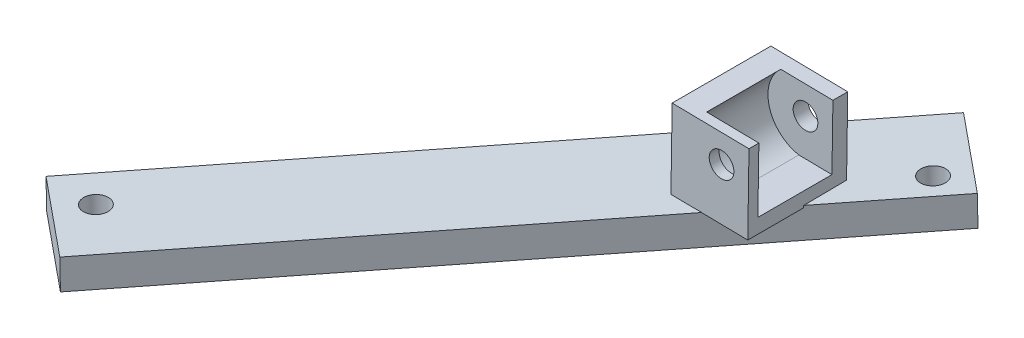
ISO-10303-21;
HEADER;
FILE_DESCRIPTION(('STEP AP214'),'2;1');
FILE_NAME('part.step','',(''),(''),'','','');
FILE_SCHEMA(('AUTOMOTIVE_DESIGN { 1 0 10303 214 1 1 1 1 }'));
ENDSEC;
DATA;
#1=APPLICATION_CONTEXT('core data for automotive mechanical design processes');
#2=APPLICATION_PROTOCOL_DEFINITION('international standard','automotive_design',2000,#1);
#3=PRODUCT_CONTEXT('',#1,'mechanical');
#4=PRODUCT('Part','Part','',(#3));
#5=PRODUCT_RELATED_PRODUCT_CATEGORY('part','',(#4));
#6=PRODUCT_DEFINITION_FORMATION('','',#4);
#7=PRODUCT_DEFINITION_CONTEXT('part definition',#1,'design');
#8=PRODUCT_DEFINITION('design','',#6,#7);
#9=PRODUCT_DEFINITION_SHAPE('','',#8);
#10=(LENGTH_UNIT() NAMED_UNIT(*) SI_UNIT(.MILLI.,.METRE.));
#11=(NAMED_UNIT(*) PLANE_ANGLE_UNIT() SI_UNIT($,.RADIAN.));
#12=(NAMED_UNIT(*) SI_UNIT($,.STERADIAN.) SOLID_ANGLE_UNIT());
#13=UNCERTAINTY_MEASURE_WITH_UNIT(LENGTH_MEASURE(1.E-05),#10,'distance_accuracy_value','');
#14=(GEOMETRIC_REPRESENTATION_CONTEXT(3) GLOBAL_UNCERTAINTY_ASSIGNED_CONTEXT((#13)) GLOBAL_UNIT_ASSIGNED_CONTEXT((#10,
#11,#12)) REPRESENTATION_CONTEXT('',''));
#15=CARTESIAN_POINT('',(0.,0.,0.));
#16=DIRECTION('',(0.,0.,1.));
#17=DIRECTION('',(1.,0.,0.));
#18=AXIS2_PLACEMENT_3D('',#15,#16,#17);
#19=CARTESIAN_POINT('',(1.23244160219368,80.7225949257512,21.59));
#20=DIRECTION('',(0.0152658371215677,0.999883470318906,0.));
#21=DIRECTION('',(-0.999883470318906,0.0152658371215677,0.));
#22=AXIS2_PLACEMENT_3D('',#19,#20,#21);
#23=PLANE('',#22);
#24=DIRECTION('',(0.,0.,-1.));
#25=VECTOR('',#24,1.);
#26=CARTESIAN_POINT('',(-621.150306901994,90.224895891791,21.59));
#27=LINE('',#26,#25);
#28=CARTESIAN_POINT('',(-621.150306901994,90.224895891791,21.59));
#29=VERTEX_POINT('',#28);
#30=CARTESIAN_POINT('',(-621.150306901994,90.224895891791,7.21198114716159));
#31=VERTEX_POINT('',#30);
#32=EDGE_CURVE('E261',#29,#31,#27,.T.);
#33=ORIENTED_EDGE('',*,*,#32,.F.);
#34=DIRECTION('',(-0.999883470318906,0.0152658371215677,0.));
#35=VECTOR('',#34,1.);
#36=CARTESIAN_POINT('',(1.23244160219368,80.7225949257512,21.59));
#37=LINE('',#36,#35);
#38=CARTESIAN_POINT('',(-632.948418817548,90.4050249370161,21.59));
#39=VERTEX_POINT('',#38);
#40=EDGE_CURVE('E246',#29,#39,#37,.T.);
#41=ORIENTED_EDGE('',*,*,#40,.T.);
#42=DIRECTION('',(-0.634311385000374,0.00968442281047344,0.773016997752142));
#43=VECTOR('',#42,1.);
#44=CARTESIAN_POINT('',(-377.72567926426,86.5083820907271,-289.442594641894));
#45=LINE('',#44,#43);
#46=EDGE_CURVE('E196',#31,#39,#45,.T.);
#47=ORIENTED_EDGE('',*,*,#46,.F.);
#48=EDGE_LOOP('',(#33,#41,#47));
#49=FACE_BOUND('',#48,.T.);
#50=ADVANCED_FACE('F43',(#49),#23,.F.);
#51=CARTESIAN_POINT('',(-627.893070479448,103.664395922966,21.59));
#52=DIRECTION('',(0.,0.,-1.));
#53=DIRECTION('',(1.,0.,0.));
#54=AXIS2_PLACEMENT_3D('',#51,#52,#53);
#55=CYLINDRICAL_SURFACE('',#54,9.65200000000006);
#56=CARTESIAN_POINT('',(-627.893070479448,103.664395922966,19.0499999999996));
#57=DIRECTION('',(0.,0.,-1.));
#58=DIRECTION('',(-1.,0.,0.));
#59=AXIS2_PLACEMENT_3D('',#56,#57,#58);
#60=CIRCLE('',#59,9.65200000000008);
#61=CARTESIAN_POINT('',(-629.598897848948,94.164329766067,19.0499999999997));
#62=VERTEX_POINT('',#61);
#63=CARTESIAN_POINT('',(-634.25254540357,110.925124721748,19.0499999999998));
#64=VERTEX_POINT('',#63);
#65=EDGE_CURVE('E225',#62,#64,#60,.T.);
#66=ORIENTED_EDGE('',*,*,#65,.F.);
#67=DIRECTION('',(0.,0.,-1.));
#68=VECTOR('',#67,1.);
#69=CARTESIAN_POINT('',(-629.598897848948,94.164329766067,21.59));
#70=LINE('',#69,#68);
#71=CARTESIAN_POINT('',(-629.598897848948,94.164329766067,0.));
#72=VERTEX_POINT('',#71);
#73=EDGE_CURVE('E255',#62,#72,#70,.T.);
#74=ORIENTED_EDGE('',*,*,#73,.T.);
#75=CARTESIAN_POINT('',(-627.893070479448,103.664395922966,0.));
#76=DIRECTION('',(0.,0.,1.));
#77=DIRECTION('',(1.,0.,0.));
#78=AXIS2_PLACEMENT_3D('',#75,#76,#77);
#79=CIRCLE('',#78,9.65200000000006);
#80=CARTESIAN_POINT('',(-634.25254540357,110.925124721748,0.));
#81=VERTEX_POINT('',#80);
#82=EDGE_CURVE('E238',#81,#72,#79,.T.);
#83=ORIENTED_EDGE('',*,*,#82,.F.);
#84=DIRECTION('',(0.,0.,-1.));
#85=VECTOR('',#84,1.);
#86=CARTESIAN_POINT('',(-634.25254540357,110.925124721748,21.59));
#87=LINE('',#86,#85);
#88=EDGE_CURVE('E251',#64,#81,#87,.T.);
#89=ORIENTED_EDGE('',*,*,#88,.F.);
#90=EDGE_LOOP('',(#66,#74,#83,#89));
#91=FACE_BOUND('',#90,.T.);
#92=ADVANCED_FACE('F45',(#91),#55,.F.);
#93=CARTESIAN_POINT('',(1.29060444162685,84.5321509476663,21.59));
#94=DIRECTION('',(0.0152658371215677,0.999883470318906,0.));
#95=DIRECTION('',(-0.999883470318906,0.0152658371215677,0.));
#96=AXIS2_PLACEMENT_3D('',#93,#94,#95);
#97=PLANE('',#96);
#98=DIRECTION('',(0.,0.,-1.));
#99=VECTOR('',#98,1.);
#100=CARTESIAN_POINT('',(-621.092144062561,94.0344519137061,21.59));
#101=LINE('',#100,#99);
#102=CARTESIAN_POINT('',(-621.092144062561,94.0344519137061,19.0499999999996));
#103=VERTEX_POINT('',#102);
#104=CARTESIAN_POINT('',(-621.092144062561,94.0344519137061,0.));
#105=VERTEX_POINT('',#104);
#106=EDGE_CURVE('E258',#103,#105,#101,.T.);
#107=ORIENTED_EDGE('',*,*,#106,.T.);
#108=DIRECTION('',(-0.999883470318906,0.0152658371215677,0.));
#109=VECTOR('',#108,1.);
#110=CARTESIAN_POINT('',(1.29060444162685,84.5321509476663,0.));
#111=LINE('',#110,#109);
#112=EDGE_CURVE('E242',#105,#72,#111,.T.);
#113=ORIENTED_EDGE('',*,*,#112,.T.);
#114=ORIENTED_EDGE('',*,*,#73,.F.);
#115=DIRECTION('',(-0.999883470318906,0.0152658371215695,0.));
#116=VECTOR('',#115,1.);
#117=CARTESIAN_POINT('',(1.29060444162699,84.5321509476652,19.05));
#118=LINE('',#117,#116);
#119=EDGE_CURVE('E65',#103,#62,#118,.T.);
#120=ORIENTED_EDGE('',*,*,#119,.F.);
#121=EDGE_LOOP('',(#107,#113,#114,#120));
#122=FACE_BOUND('',#121,.T.);
#123=ADVANCED_FACE('F307',(#122),#97,.T.);
#124=CARTESIAN_POINT('',(-622.382748504188,9.50230096603983,21.59));
#125=DIRECTION('',(-0.999883470318906,0.0152658371215677,0.));
#126=DIRECTION('',(-0.0152658371215678,-0.999883470318906,0.));
#127=AXIS2_PLACEMENT_3D('',#124,#125,#126);
#128=PLANE('',#127);
#129=DIRECTION('',(-0.000170947301251259,-0.0111967250440051,0.999937300097016));
#130=VECTOR('',#129,1.);
#131=CARTESIAN_POINT('',(-621.144892584329,90.5795234627043,22.4980679115256));
#132=LINE('',#131,#130);
#133=CARTESIAN_POINT('',(-621.140395009121,90.8741061358537,-3.81));
#134=VERTEX_POINT('',#133);
#135=CARTESIAN_POINT('',(-621.142277501478,90.750806445438,7.20143048993949));
#136=VERTEX_POINT('',#135);
#137=EDGE_CURVE('E192',#134,#136,#132,.T.);
#138=ORIENTED_EDGE('',*,*,#137,.F.);
#139=DIRECTION('',(-0.0152658371215623,-0.999883470318906,0.));
#140=VECTOR('',#139,1.);
#141=CARTESIAN_POINT('',(-620.837390825843,110.720307289694,-3.81));
#142=LINE('',#141,#140);
#143=CARTESIAN_POINT('',(-620.837390825843,110.720307289694,-3.81));
#144=VERTEX_POINT('',#143);
#145=EDGE_CURVE('E214',#144,#134,#142,.T.);
#146=ORIENTED_EDGE('',*,*,#145,.F.);
#147=DIRECTION('',(0.,0.,1.));
#148=VECTOR('',#147,1.);
#149=CARTESIAN_POINT('',(-620.837390825843,110.720307289694,-3.81));
#150=LINE('',#149,#148);
#151=CARTESIAN_POINT('',(-620.837390825843,110.720307289694,0.));
#152=VERTEX_POINT('',#151);
#153=EDGE_CURVE('E216',#144,#152,#150,.T.);
#154=ORIENTED_EDGE('',*,*,#153,.T.);
#155=DIRECTION('',(-0.0152658371215623,-0.999883470318906,0.));
#156=VECTOR('',#155,1.);
#157=CARTESIAN_POINT('',(-620.837390825843,110.720307289694,0.));
#158=LINE('',#157,#156);
#159=EDGE_CURVE('E212',#152,#105,#158,.T.);
#160=ORIENTED_EDGE('',*,*,#159,.T.);
#161=ORIENTED_EDGE('',*,*,#106,.F.);
#162=DIRECTION('',(0.0152658371215684,0.999883470318906,0.));
#163=VECTOR('',#162,1.);
#164=CARTESIAN_POINT('',(-622.382748504188,9.50230096604021,19.0499999999996));
#165=LINE('',#164,#163);
#166=CARTESIAN_POINT('',(-620.837390825843,110.720307289694,19.0499999999998));
#167=VERTEX_POINT('',#166);
#168=EDGE_CURVE('E221',#103,#167,#165,.T.);
#169=ORIENTED_EDGE('',*,*,#168,.T.);
#170=DIRECTION('',(0.,0.,-1.));
#171=VECTOR('',#170,1.);
#172=CARTESIAN_POINT('',(-620.837390825843,110.720307289694,45.3479752360297));
#173=LINE('',#172,#171);
#174=CARTESIAN_POINT('',(-620.837390825843,110.720307289694,21.59));
#175=VERTEX_POINT('',#174);
#176=EDGE_CURVE('E232',#175,#167,#173,.T.);
#177=ORIENTED_EDGE('',*,*,#176,.F.);
#178=DIRECTION('',(-0.0152658371215678,-0.999883470318906,0.));
#179=VECTOR('',#178,1.);
#180=CARTESIAN_POINT('',(-622.382748504188,9.50230096603983,21.59));
#181=LINE('',#180,#179);
#182=EDGE_CURVE('E249',#175,#29,#181,.T.);
#183=ORIENTED_EDGE('',*,*,#182,.T.);
#184=ORIENTED_EDGE('',*,*,#32,.T.);
#185=DIRECTION('',(-0.0152627667310032,-0.999682365541718,0.0200553229001458));
#186=VECTOR('',#185,1.);
#187=CARTESIAN_POINT('',(-622.38665390396,9.24650466437761,8.83654494860488));
#188=LINE('',#187,#186);
#189=EDGE_CURVE('E199',#136,#31,#188,.T.);
#190=ORIENTED_EDGE('',*,*,#189,.F.);
#191=EDGE_LOOP('',(#138,#146,#154,#160,#161,#169,#177,#183,#184,#190));
#192=FACE_BOUND('',#191,.T.);
#193=ADVANCED_FACE('F287',(#192),#128,.F.);
#194=CARTESIAN_POINT('',(-635.371075882775,90.4420131353982,21.59));
#195=VERTEX_POINT('',#194);
#196=CARTESIAN_POINT('',(-640.914721516246,90.5266513895672,21.59));
#197=VERTEX_POINT('',#196);
#198=EDGE_CURVE('E245',#195,#197,#37,.T.);
#199=ORIENTED_EDGE('',*,*,#198,.T.);
#200=DIRECTION('',(0.,0.,-1.));
#201=VECTOR('',#200,1.);
#202=CARTESIAN_POINT('',(-640.914721516246,90.5266513895672,21.59));
#203=LINE('',#202,#201);
#204=CARTESIAN_POINT('',(-640.914721516246,90.5266513895672,8.89000000001139));
#205=VERTEX_POINT('',#204);
#206=EDGE_CURVE('E264',#197,#205,#203,.T.);
#207=ORIENTED_EDGE('',*,*,#206,.T.);
#208=DIRECTION('',(-0.400047773889427,0.00610777589421889,-0.916473935079302));
#209=VECTOR('',#208,1.);
#210=CARTESIAN_POINT('',(-533.46643276404,88.8861721499623,255.044490632144));
#211=LINE('',#210,#209);
#212=EDGE_CURVE('E188',#195,#205,#211,.T.);
#213=ORIENTED_EDGE('',*,*,#212,.F.);
#214=EDGE_LOOP('',(#199,#207,#213));
#215=FACE_BOUND('',#214,.T.);
#216=ADVANCED_FACE('F314',(#215),#23,.F.);
#217=CARTESIAN_POINT('',(-642.147163118439,9.80405646381606,21.59));
#218=DIRECTION('',(0.999883470318906,-0.0152658371215678,0.));
#219=DIRECTION('',(0.0152658371215678,0.999883470318906,0.));
#220=AXIS2_PLACEMENT_3D('',#217,#218,#219);
#221=PLANE('',#220);
#222=ORIENTED_EDGE('',*,*,#206,.F.);
#223=DIRECTION('',(0.0152658371215678,0.999883470318906,0.));
#224=VECTOR('',#223,1.);
#225=CARTESIAN_POINT('',(-642.147163118439,9.80405646381606,21.59));
#226=LINE('',#225,#224);
#227=CARTESIAN_POINT('',(-640.601805440095,111.02206278747,21.59));
#228=VERTEX_POINT('',#227);
#229=EDGE_CURVE('E241',#197,#228,#226,.T.);
#230=ORIENTED_EDGE('',*,*,#229,.T.);
#231=DIRECTION('',(0.,0.,-1.));
#232=VECTOR('',#231,1.);
#233=CARTESIAN_POINT('',(-640.601805440095,111.02206278747,21.59));
#234=LINE('',#233,#232);
#235=CARTESIAN_POINT('',(-640.601805440095,111.02206278747,-3.81));
#236=VERTEX_POINT('',#235);
#237=EDGE_CURVE('E267',#228,#236,#234,.T.);
#238=ORIENTED_EDGE('',*,*,#237,.T.);
#239=DIRECTION('',(0.0152658371215677,0.999883470318906,0.));
#240=VECTOR('',#239,1.);
#241=CARTESIAN_POINT('',(-640.914721516246,90.5266513895672,-3.81));
#242=LINE('',#241,#240);
#243=CARTESIAN_POINT('',(-640.912550349388,90.6688587140116,-3.81));
#244=VERTEX_POINT('',#243);
#245=EDGE_CURVE('E208',#244,#236,#242,.T.);
#246=ORIENTED_EDGE('',*,*,#245,.F.);
#247=DIRECTION('',(0.000170947301251259,0.0111967250440051,-0.999937300097016));
#248=VECTOR('',#247,1.);
#249=CARTESIAN_POINT('',(-640.917046953941,90.3743396169369,22.4923901719979));
#250=LINE('',#249,#248);
#251=EDGE_CURVE('E186',#205,#244,#250,.T.);
#252=ORIENTED_EDGE('',*,*,#251,.F.);
#253=EDGE_LOOP('',(#222,#230,#238,#246,#252));
#254=FACE_BOUND('',#253,.T.);
#255=ADVANCED_FACE('F294',(#254),#221,.F.);
#256=CARTESIAN_POINT('',(1.54535767834408,101.218006323655,21.59));
#257=DIRECTION('',(-0.015265837121567,-0.999883470318906,0.));
#258=DIRECTION('',(0.999883470318906,-0.015265837121567,0.));
#259=AXIS2_PLACEMENT_3D('',#256,#257,#258);
#260=PLANE('',#259);
#261=ORIENTED_EDGE('',*,*,#237,.F.);
#262=DIRECTION('',(0.999883470318906,-0.015265837121567,0.));
#263=VECTOR('',#262,1.);
#264=CARTESIAN_POINT('',(1.54535767834408,101.218006323655,21.59));
#265=LINE('',#264,#263);
#266=EDGE_CURVE('E239',#228,#175,#265,.T.);
#267=ORIENTED_EDGE('',*,*,#266,.T.);
#268=ORIENTED_EDGE('',*,*,#176,.T.);
#269=DIRECTION('',(0.999883470318906,-0.0152658371215682,0.));
#270=VECTOR('',#269,1.);
#271=CARTESIAN_POINT('',(1.54535767834418,101.218006323654,19.0499999999998));
#272=LINE('',#271,#270);
#273=EDGE_CURVE('E227',#64,#167,#272,.T.);
#274=ORIENTED_EDGE('',*,*,#273,.F.);
#275=ORIENTED_EDGE('',*,*,#88,.T.);
#276=DIRECTION('',(0.999883470318906,-0.0152658371215671,0.));
#277=VECTOR('',#276,1.);
#278=CARTESIAN_POINT('',(-640.601805440095,111.02206278747,0.));
#279=LINE('',#278,#277);
#280=EDGE_CURVE('E205',#81,#152,#279,.T.);
#281=ORIENTED_EDGE('',*,*,#280,.T.);
#282=ORIENTED_EDGE('',*,*,#153,.F.);
#283=DIRECTION('',(0.999883470318906,-0.0152658371215671,0.));
#284=VECTOR('',#283,1.);
#285=CARTESIAN_POINT('',(-640.601805440095,111.02206278747,-3.81));
#286=LINE('',#285,#284);
#287=EDGE_CURVE('E211',#236,#144,#286,.T.);
#288=ORIENTED_EDGE('',*,*,#287,.F.);
#289=EDGE_LOOP('',(#261,#267,#268,#274,#275,#281,#282,#288));
#290=FACE_BOUND('',#289,.T.);
#291=ADVANCED_FACE('F275',(#290),#260,.F.);
#292=CARTESIAN_POINT('',(0.,0.,21.59));
#293=DIRECTION('',(0.,0.,-1.));
#294=DIRECTION('',(1.,0.,0.));
#295=AXIS2_PLACEMENT_3D('',#292,#293,#294);
#296=PLANE('',#295);
#297=ORIENTED_EDGE('',*,*,#40,.F.);
#298=ORIENTED_EDGE('',*,*,#182,.F.);
#299=ORIENTED_EDGE('',*,*,#266,.F.);
#300=ORIENTED_EDGE('',*,*,#229,.F.);
#301=ORIENTED_EDGE('',*,*,#198,.F.);
#302=DIRECTION('',(-0.999946125618088,-0.0103800703935441,0.));
#303=VECTOR('',#302,1.);
#304=CARTESIAN_POINT('',(-1.00720248977155,97.0271095643389,21.59));
#305=LINE('',#304,#303);
#306=CARTESIAN_POINT('',(-632.94849300974,90.467161070984,21.59));
#307=VERTEX_POINT('',#306);
#308=EDGE_CURVE('E194',#307,#195,#305,.T.);
#309=ORIENTED_EDGE('',*,*,#308,.F.);
#310=DIRECTION('',(-0.00119402567209791,0.999999287151093,0.));
#311=VECTOR('',#310,1.);
#312=CARTESIAN_POINT('',(-632.83957058098,-0.755627232241153,21.59));
#313=LINE('',#312,#311);
#314=EDGE_CURVE('E11',#39,#307,#313,.T.);
#315=ORIENTED_EDGE('',*,*,#314,.F.);
#316=EDGE_LOOP('',(#297,#298,#299,#300,#301,#309,#315));
#317=FACE_BOUND('',#316,.T.);
#318=CARTESIAN_POINT('',(-627.893070479448,103.664395922966,21.59));
#319=DIRECTION('',(0.,0.,1.));
#320=DIRECTION('',(1.,0.,0.));
#321=AXIS2_PLACEMENT_3D('',#318,#319,#320);
#322=CIRCLE('',#321,3.17500000000009);
#323=CARTESIAN_POINT('',(-624.718070479448,103.664395922966,21.59));
#324=VERTEX_POINT('',#323);
#325=EDGE_CURVE('E235',#324,#324,#322,.F.);
#326=ORIENTED_EDGE('',*,*,#325,.T.);
#327=EDGE_LOOP('',(#326));
#328=FACE_BOUND('',#327,.T.);
#329=ADVANCED_FACE('F299',(#317,#328),#296,.F.);
#330=CARTESIAN_POINT('',(1.11022302462516E-13,0.,19.0499999999998));
#331=DIRECTION('',(0.,0.,1.));
#332=DIRECTION('',(-1.,0.,0.));
#333=AXIS2_PLACEMENT_3D('',#330,#331,#332);
#334=PLANE('',#333);
#335=ORIENTED_EDGE('',*,*,#168,.F.);
#336=ORIENTED_EDGE('',*,*,#119,.T.);
#337=ORIENTED_EDGE('',*,*,#65,.T.);
#338=ORIENTED_EDGE('',*,*,#273,.T.);
#339=EDGE_LOOP('',(#335,#336,#337,#338));
#340=FACE_BOUND('',#339,.T.);
#341=CARTESIAN_POINT('',(-627.893070479448,103.664395922966,19.0499999999996));
#342=DIRECTION('',(0.,0.,-1.));
#343=DIRECTION('',(-1.,0.,0.));
#344=AXIS2_PLACEMENT_3D('',#341,#342,#343);
#345=CIRCLE('',#344,3.17500000000009);
#346=CARTESIAN_POINT('',(-631.068070479448,103.664395922966,19.0499999999996));
#347=VERTEX_POINT('',#346);
#348=EDGE_CURVE('E229',#347,#347,#345,.F.);
#349=ORIENTED_EDGE('',*,*,#348,.T.);
#350=EDGE_LOOP('',(#349));
#351=FACE_BOUND('',#350,.T.);
#352=ADVANCED_FACE('F304',(#340,#351),#334,.F.);
#353=CARTESIAN_POINT('',(-627.893070479448,103.664395922966,45.3479752360294));
#354=DIRECTION('',(0.,0.,-1.));
#355=DIRECTION('',(1.,0.,0.));
#356=AXIS2_PLACEMENT_3D('',#353,#354,#355);
#357=CYLINDRICAL_SURFACE('',#356,3.17500000000009);
#358=ORIENTED_EDGE('',*,*,#325,.F.);
#359=EDGE_LOOP('',(#358));
#360=FACE_BOUND('',#359,.T.);
#361=ORIENTED_EDGE('',*,*,#348,.F.);
#362=EDGE_LOOP('',(#361));
#363=FACE_BOUND('',#362,.T.);
#364=ADVANCED_FACE('F388',(#360,#363),#357,.F.);
#365=CARTESIAN_POINT('',(0.,0.,0.));
#366=DIRECTION('',(0.,0.,1.));
#367=DIRECTION('',(-1.,0.,0.));
#368=AXIS2_PLACEMENT_3D('',#365,#366,#367);
#369=PLANE('',#368);
#370=CARTESIAN_POINT('',(-627.893070479448,103.664395922966,0.));
#371=DIRECTION('',(0.,0.,1.));
#372=DIRECTION('',(1.,0.,0.));
#373=AXIS2_PLACEMENT_3D('',#370,#371,#372);
#374=CIRCLE('',#373,3.17500000000008);
#375=CARTESIAN_POINT('',(-631.068070479448,103.664395922966,0.));
#376=VERTEX_POINT('',#375);
#377=EDGE_CURVE('E201',#376,#376,#374,.T.);
#378=ORIENTED_EDGE('',*,*,#377,.F.);
#379=EDGE_LOOP('',(#378));
#380=FACE_BOUND('',#379,.T.);
#381=ORIENTED_EDGE('',*,*,#82,.T.);
#382=ORIENTED_EDGE('',*,*,#112,.F.);
#383=ORIENTED_EDGE('',*,*,#159,.F.);
#384=ORIENTED_EDGE('',*,*,#280,.F.);
#385=EDGE_LOOP('',(#381,#382,#383,#384));
#386=FACE_BOUND('',#385,.T.);
#387=ADVANCED_FACE('F282',(#380,#386),#369,.T.);
#388=CARTESIAN_POINT('',(0.,0.,-3.81));
#389=DIRECTION('',(0.,0.,1.));
#390=DIRECTION('',(-1.,0.,0.));
#391=AXIS2_PLACEMENT_3D('',#388,#389,#390);
#392=PLANE('',#391);
#393=ORIENTED_EDGE('',*,*,#245,.T.);
#394=ORIENTED_EDGE('',*,*,#287,.T.);
#395=ORIENTED_EDGE('',*,*,#145,.T.);
#396=DIRECTION('',(0.999946125618088,0.0103800703935441,0.));
#397=VECTOR('',#396,1.);
#398=CARTESIAN_POINT('',(-1.01015410692916,97.3114484974248,-3.81));
#399=LINE('',#398,#397);
#400=EDGE_CURVE('E51',#244,#134,#399,.T.);
#401=ORIENTED_EDGE('',*,*,#400,.F.);
#402=EDGE_LOOP('',(#393,#394,#395,#401));
#403=FACE_BOUND('',#402,.T.);
#404=CARTESIAN_POINT('',(-627.893070479448,103.664395922966,-3.81));
#405=DIRECTION('',(0.,0.,1.));
#406=DIRECTION('',(1.,0.,0.));
#407=AXIS2_PLACEMENT_3D('',#404,#405,#406);
#408=CIRCLE('',#407,3.17500000000008);
#409=CARTESIAN_POINT('',(-631.068070479448,103.664395922966,-3.81));
#410=VERTEX_POINT('',#409);
#411=EDGE_CURVE('E202',#410,#410,#408,.T.);
#412=ORIENTED_EDGE('',*,*,#411,.T.);
#413=EDGE_LOOP('',(#412));
#414=FACE_BOUND('',#413,.T.);
#415=ADVANCED_FACE('F290',(#403,#414),#392,.F.);
#416=CARTESIAN_POINT('',(-627.893070479448,103.664395922966,-3.81));
#417=DIRECTION('',(0.,0.,1.));
#418=DIRECTION('',(-1.,0.,0.));
#419=AXIS2_PLACEMENT_3D('',#416,#417,#418);
#420=CYLINDRICAL_SURFACE('',#419,3.17500000000008);
#421=CARTESIAN_POINT('',(-631.068070479448,103.664395922966,-3.81));
#422=CARTESIAN_POINT('',(-631.068070479448,103.664395922966,-3.7703125));
#423=CARTESIAN_POINT('',(-631.068070479448,103.664395922966,-3.730625));
#424=CARTESIAN_POINT('',(-631.068070479448,103.664395922966,-3.65125));
#425=CARTESIAN_POINT('',(-631.068070479448,103.664395922966,-3.6115625));
#426=CARTESIAN_POINT('',(-631.068070479448,103.664395922966,-3.5321875));
#427=CARTESIAN_POINT('',(-631.068070479448,103.664395922966,-3.4925));
#428=CARTESIAN_POINT('',(-631.068070479448,103.664395922966,-3.413125));
#429=CARTESIAN_POINT('',(-631.068070479448,103.664395922966,-3.3734375));
#430=CARTESIAN_POINT('',(-631.068070479448,103.664395922966,-3.2940625));
#431=CARTESIAN_POINT('',(-631.068070479448,103.664395922966,-3.254375));
#432=CARTESIAN_POINT('',(-631.068070479448,103.664395922966,-3.175));
#433=CARTESIAN_POINT('',(-631.068070479448,103.664395922966,-3.1353125));
#434=CARTESIAN_POINT('',(-631.068070479448,103.664395922966,-3.0559375));
#435=CARTESIAN_POINT('',(-631.068070479448,103.664395922966,-3.01625));
#436=CARTESIAN_POINT('',(-631.068070479448,103.664395922966,-2.936875));
#437=CARTESIAN_POINT('',(-631.068070479448,103.664395922966,-2.8971875));
#438=CARTESIAN_POINT('',(-631.068070479448,103.664395922966,-2.8178125));
#439=CARTESIAN_POINT('',(-631.068070479448,103.664395922966,-2.778125));
#440=CARTESIAN_POINT('',(-631.068070479448,103.664395922966,-2.69875));
#441=CARTESIAN_POINT('',(-631.068070479448,103.664395922966,-2.6590625));
#442=CARTESIAN_POINT('',(-631.068070479448,103.664395922966,-2.5796875));
#443=CARTESIAN_POINT('',(-631.068070479448,103.664395922966,-2.54));
#444=CARTESIAN_POINT('',(-631.068070479448,103.664395922966,-2.460625));
#445=CARTESIAN_POINT('',(-631.068070479448,103.664395922966,-2.4209375));
#446=CARTESIAN_POINT('',(-631.068070479448,103.664395922966,-2.3415625));
#447=CARTESIAN_POINT('',(-631.068070479448,103.664395922966,-2.301875));
#448=CARTESIAN_POINT('',(-631.068070479448,103.664395922966,-2.2225));
#449=CARTESIAN_POINT('',(-631.068070479448,103.664395922966,-2.1828125));
#450=CARTESIAN_POINT('',(-631.068070479448,103.664395922966,-2.1034375));
#451=CARTESIAN_POINT('',(-631.068070479448,103.664395922966,-2.06375));
#452=CARTESIAN_POINT('',(-631.068070479448,103.664395922966,-1.984375));
#453=CARTESIAN_POINT('',(-631.068070479448,103.664395922966,-1.9446875));
#454=CARTESIAN_POINT('',(-631.068070479448,103.664395922966,-1.8653125));
#455=CARTESIAN_POINT('',(-631.068070479448,103.664395922966,-1.825625));
#456=CARTESIAN_POINT('',(-631.068070479448,103.664395922966,-1.74625));
#457=CARTESIAN_POINT('',(-631.068070479448,103.664395922966,-1.7065625));
#458=CARTESIAN_POINT('',(-631.068070479448,103.664395922966,-1.6271875));
#459=CARTESIAN_POINT('',(-631.068070479448,103.664395922966,-1.5875));
#460=CARTESIAN_POINT('',(-631.068070479448,103.664395922966,-1.508125));
#461=CARTESIAN_POINT('',(-631.068070479448,103.664395922966,-1.4684375));
#462=CARTESIAN_POINT('',(-631.068070479448,103.664395922966,-1.3890625));
#463=CARTESIAN_POINT('',(-631.068070479448,103.664395922966,-1.349375));
#464=CARTESIAN_POINT('',(-631.068070479448,103.664395922966,-1.27));
#465=CARTESIAN_POINT('',(-631.068070479448,103.664395922966,-1.2303125));
#466=CARTESIAN_POINT('',(-631.068070479448,103.664395922966,-1.1509375));
#467=CARTESIAN_POINT('',(-631.068070479448,103.664395922966,-1.11125));
#468=CARTESIAN_POINT('',(-631.068070479448,103.664395922966,-1.031875));
#469=CARTESIAN_POINT('',(-631.068070479448,103.664395922966,-0.9921875));
#470=CARTESIAN_POINT('',(-631.068070479448,103.664395922966,-0.9128125));
#471=CARTESIAN_POINT('',(-631.068070479448,103.664395922966,-0.873125));
#472=CARTESIAN_POINT('',(-631.068070479448,103.664395922966,-0.79375));
#473=CARTESIAN_POINT('',(-631.068070479448,103.664395922966,-0.7540625));
#474=CARTESIAN_POINT('',(-631.068070479448,103.664395922966,-0.6746875));
#475=CARTESIAN_POINT('',(-631.068070479448,103.664395922966,-0.635));
#476=CARTESIAN_POINT('',(-631.068070479448,103.664395922966,-0.555625));
#477=CARTESIAN_POINT('',(-631.068070479448,103.664395922966,-0.5159375));
#478=CARTESIAN_POINT('',(-631.068070479448,103.664395922966,-0.4365625));
#479=CARTESIAN_POINT('',(-631.068070479448,103.664395922966,-0.396875));
#480=CARTESIAN_POINT('',(-631.068070479448,103.664395922966,-0.3175));
#481=CARTESIAN_POINT('',(-631.068070479448,103.664395922966,-0.2778125));
#482=CARTESIAN_POINT('',(-631.068070479448,103.664395922966,-0.1984375));
#483=CARTESIAN_POINT('',(-631.068070479448,103.664395922966,-0.15875));
#484=CARTESIAN_POINT('',(-631.068070479448,103.664395922966,-0.0793749999999999));
#485=CARTESIAN_POINT('',(-631.068070479448,103.664395922966,-0.0396874999999999));
#486=CARTESIAN_POINT('',(-631.068070479448,103.664395922966,0.));
#487=B_SPLINE_CURVE_WITH_KNOTS('',3,(#421,#422,#423,#424,#425,#426,#427,#428,#429,#430,#431,
#432,#433,#434,#435,#436,#437,#438,#439,#440,#441,#442,#443,#444,#445,#446,#447,#448,#449,#450,
#451,#452,#453,#454,#455,#456,#457,#458,#459,#460,#461,#462,#463,#464,#465,#466,#467,#468,#469,
#470,#471,#472,#473,#474,#475,#476,#477,#478,#479,#480,#481,#482,#483,#484,#485,#486),
.UNSPECIFIED.,.F.,.F.,(4,2,2,2,2,2,2,2,2,2,2,2,2,2,2,2,2,2,2,2,2,2,2,2,2,2,2,2,2,2,2,2,4),(0.,
0.1190625,0.238125,0.3571875,0.47625,0.5953125,0.714375,0.833437499999999,0.9525,1.0715625,
1.190625,1.3096875,1.42875,1.5478125,1.666875,1.7859375,1.905,2.0240625,2.143125,2.2621875,
2.38125,2.5003125,2.619375,2.7384375,2.8575,2.9765625,3.095625,3.2146875,3.33375,3.4528125,
3.571875,3.6909375,3.81),.UNSPECIFIED.);
#488=EDGE_CURVE('BSEAM380',#410,#376,#487,.T.);
#489=ORIENTED_EDGE('',*,*,#411,.F.);
#490=ORIENTED_EDGE('',*,*,#377,.T.);
#491=ORIENTED_EDGE('',*,*,#488,.T.);
#492=ORIENTED_EDGE('',*,*,#488,.F.);
#493=EDGE_LOOP('',(#489,#491,#490,#492));
#494=FACE_BOUND('',#493,.T.);
#495=ADVANCED_FACE('F380',(#494),#420,.F.);
#496=CARTESIAN_POINT('',(-598.933047617442,-109.392226583411,-19.5735725149561));
#497=DIRECTION('',(0.77305859160453,0.0009230524624086,0.634333951417211));
#498=DIRECTION('',(-0.634334221651845,0.,0.773058920937691));
#499=AXIS2_PLACEMENT_3D('',#496,#497,#498);
#500=PLANE('',#499);
#501=ORIENTED_EDGE('',*,*,#189,.T.);
#502=ORIENTED_EDGE('',*,*,#46,.T.);
#503=ORIENTED_EDGE('',*,*,#314,.T.);
#504=DIRECTION('',(-0.634249699713803,-0.0152379052751319,0.772978088082565));
#505=VECTOR('',#504,1.);
#506=CARTESIAN_POINT('',(-601.015677803405,91.2343497878284,-17.3274270897168));
#507=LINE('',#506,#505);
#508=CARTESIAN_POINT('',(-707.389841879863,88.678701063596,112.313782052841));
#509=VERTEX_POINT('',#508);
#510=EDGE_CURVE('E332',#307,#509,#507,.T.);
#511=ORIENTED_EDGE('',*,*,#510,.T.);
#512=DIRECTION('',(-0.0103794199920881,0.999883470318906,0.011194347843894));
#513=VECTOR('',#512,1.);
#514=CARTESIAN_POINT('',(-705.3072116939,-111.947875307643,110.067636627602));
#515=LINE('',#514,#513);
#516=CARTESIAN_POINT('',(-707.309085475429,80.8991725372241,112.226685155081));
#517=VERTEX_POINT('',#516);
#518=EDGE_CURVE('E169',#517,#509,#515,.T.);
#519=ORIENTED_EDGE('',*,*,#518,.F.);
#520=DIRECTION('',(-0.634249699713803,-0.015237905275132,0.772978088082565));
#521=VECTOR('',#520,1.);
#522=CARTESIAN_POINT('',(-600.934921398971,83.4548212614566,-17.4145239874762));
#523=LINE('',#522,#521);
#524=CARTESIAN_POINT('',(-600.934921398971,83.4548212614565,-17.4145239874762));
#525=VERTEX_POINT('',#524);
#526=EDGE_CURVE('E185',#525,#517,#523,.T.);
#527=ORIENTED_EDGE('',*,*,#526,.F.);
#528=DIRECTION('',(-0.0103794199920881,0.999883470318906,0.011194347843894));
#529=VECTOR('',#528,1.);
#530=CARTESIAN_POINT('',(-598.933047617442,-109.392226583411,-19.5735725149561));
#531=LINE('',#530,#529);
#532=CARTESIAN_POINT('',(-601.015677803405,91.2343497878284,-17.3274270897168));
#533=VERTEX_POINT('',#532);
#534=EDGE_CURVE('E162',#525,#533,#531,.T.);
#535=ORIENTED_EDGE('',*,*,#534,.T.);
#536=EDGE_CURVE('E338',#533,#136,#507,.T.);
#537=ORIENTED_EDGE('',*,*,#536,.T.);
#538=EDGE_LOOP('',(#501,#502,#503,#511,#519,#527,#535,#537));
#539=FACE_BOUND('',#538,.T.);
#540=ADVANCED_FACE('F335',(#539),#500,.T.);
#541=CARTESIAN_POINT('',(-1.00958483396755,97.2566085714132,1.08885118994776));
#542=DIRECTION('',(-0.0103794199920881,0.999883470318906,0.011194347843894));
#543=DIRECTION('',(0.,0.0111949508893725,-0.999937334573815));
#544=AXIS2_PLACEMENT_3D('',#541,#542,#543);
#545=PLANE('',#544);
#546=CARTESIAN_POINT('',(-714.339059039859,88.7882314610112,96.0871576951027));
#547=DIRECTION('',(0.0103794199920881,-0.999883470318906,-0.011194347843894));
#548=DIRECTION('',(0.,0.0111949508893725,-0.999937334573814));
#549=AXIS2_PLACEMENT_3D('',#546,#547,#548);
#550=CIRCLE('',#549,3.1750000000001);
#551=CARTESIAN_POINT('',(-714.339059039859,88.8237754300849,92.9123566578308));
#552=VERTEX_POINT('',#551);
#553=EDGE_CURVE('E175',#552,#552,#550,.T.);
#554=ORIENTED_EDGE('',*,*,#553,.T.);
#555=EDGE_LOOP('',(#554));
#556=FACE_BOUND('',#555,.T.);
#557=CARTESIAN_POINT('',(-610.732603344143,91.1147450383382,-15.6538360034777));
#558=DIRECTION('',(0.0103794199920881,-0.999883470318906,-0.011194347843894));
#559=DIRECTION('',(0.,0.0111949508893725,-0.999937334573814));
#560=AXIS2_PLACEMENT_3D('',#557,#558,#559);
#561=CIRCLE('',#560,3.1750000000001);
#562=CARTESIAN_POINT('',(-610.732603344143,91.1502890074119,-18.8286370407496));
#563=VERTEX_POINT('',#562);
#564=EDGE_CURVE('E178',#563,#563,#561,.T.);
#565=ORIENTED_EDGE('',*,*,#564,.T.);
#566=EDGE_LOOP('',(#565));
#567=FACE_BOUND('',#566,.T.);
#568=ORIENTED_EDGE('',*,*,#308,.T.);
#569=ORIENTED_EDGE('',*,*,#212,.T.);
#570=ORIENTED_EDGE('',*,*,#251,.T.);
#571=ORIENTED_EDGE('',*,*,#400,.T.);
#572=ORIENTED_EDGE('',*,*,#137,.T.);
#573=ORIENTED_EDGE('',*,*,#536,.F.);
#574=DIRECTION('',(0.773058591604525,0.000923052462408051,0.634333951417217));
#575=VECTOR('',#574,1.);
#576=CARTESIAN_POINT('',(-620.792774234318,91.2107354101369,-33.5555420900846));
#577=LINE('',#576,#575);
#578=CARTESIAN_POINT('',(-620.792774234318,91.2107354101369,-33.5555420900846));
#579=VERTEX_POINT('',#578);
#580=EDGE_CURVE('E339',#579,#533,#577,.T.);
#581=ORIENTED_EDGE('',*,*,#580,.F.);
#582=DIRECTION('',(0.634249699713808,0.0152379052751319,-0.772978088082561));
#583=VECTOR('',#582,1.);
#584=CARTESIAN_POINT('',(-727.166938310777,88.6550866859044,96.0856670524725));
#585=LINE('',#584,#583);
#586=CARTESIAN_POINT('',(-727.166938310777,88.6550866859044,96.0856670524725));
#587=VERTEX_POINT('',#586);
#588=EDGE_CURVE('E173',#587,#579,#585,.T.);
#589=ORIENTED_EDGE('',*,*,#588,.F.);
#590=DIRECTION('',(-0.773058591604527,-0.000923052462408555,-0.634333951417214));
#591=VECTOR('',#590,1.);
#592=CARTESIAN_POINT('',(-707.389841879863,88.678701063596,112.313782052841));
#593=LINE('',#592,#591);
#594=EDGE_CURVE('E352',#509,#587,#593,.T.);
#595=ORIENTED_EDGE('',*,*,#594,.F.);
#596=ORIENTED_EDGE('',*,*,#510,.F.);
#597=EDGE_LOOP('',(#568,#569,#570,#571,#572,#573,#581,#589,#595,#596));
#598=FACE_BOUND('',#597,.T.);
#599=ADVANCED_FACE('F330',(#556,#567,#598),#545,.T.);
#600=CARTESIAN_POINT('',(-705.3072116939,-111.947875307643,110.067636627602));
#601=DIRECTION('',(-0.634249699713806,-0.0152379052751319,0.772978088082562));
#602=DIRECTION('',(-0.77306784405669,0.,-0.634323346949757));
#603=AXIS2_PLACEMENT_3D('',#600,#601,#602);
#604=PLANE('',#603);
#605=ORIENTED_EDGE('',*,*,#518,.T.);
#606=ORIENTED_EDGE('',*,*,#594,.T.);
#607=DIRECTION('',(-0.0103794199920881,0.999883470318906,0.011194347843894));
#608=VECTOR('',#607,1.);
#609=CARTESIAN_POINT('',(-725.084308124814,-111.971489685335,93.8395216272332));
#610=LINE('',#609,#608);
#611=CARTESIAN_POINT('',(-727.086181906343,80.8755581595325,95.998570154713));
#612=VERTEX_POINT('',#611);
#613=EDGE_CURVE('E183',#612,#587,#610,.T.);
#614=ORIENTED_EDGE('',*,*,#613,.F.);
#615=DIRECTION('',(-0.773058591604528,-0.000923052462408635,-0.634333951417214));
#616=VECTOR('',#615,1.);
#617=CARTESIAN_POINT('',(-707.309085475429,80.899172537224,112.226685155081));
#618=LINE('',#617,#616);
#619=EDGE_CURVE('E157',#517,#612,#618,.T.);
#620=ORIENTED_EDGE('',*,*,#619,.F.);
#621=EDGE_LOOP('',(#605,#606,#614,#620));
#622=FACE_BOUND('',#621,.T.);
#623=ADVANCED_FACE('F358',(#622),#604,.T.);
#624=CARTESIAN_POINT('',(-618.710144048355,-109.415840961102,-35.801687515324));
#625=DIRECTION('',(0.634249699713809,0.0152379052751319,-0.77297808808256));
#626=DIRECTION('',(0.773067844056687,0.,0.63432334694976));
#627=AXIS2_PLACEMENT_3D('',#624,#625,#626);
#628=PLANE('',#627);
#629=DIRECTION('',(-0.0103794199920881,0.999883470318906,0.011194347843894));
#630=VECTOR('',#629,1.);
#631=CARTESIAN_POINT('',(-618.710144048355,-109.415840961102,-35.801687515324));
#632=LINE('',#631,#630);
#633=CARTESIAN_POINT('',(-620.712017829885,83.431206883765,-33.6426389878441));
#634=VERTEX_POINT('',#633);
#635=EDGE_CURVE('E161',#634,#579,#632,.T.);
#636=ORIENTED_EDGE('',*,*,#635,.T.);
#637=ORIENTED_EDGE('',*,*,#580,.T.);
#638=ORIENTED_EDGE('',*,*,#534,.F.);
#639=DIRECTION('',(0.773058591604525,0.000923052462408566,0.634333951417217));
#640=VECTOR('',#639,1.);
#641=CARTESIAN_POINT('',(-620.712017829885,83.431206883765,-33.6426389878441));
#642=LINE('',#641,#640);
#643=EDGE_CURVE('E155',#634,#525,#642,.T.);
#644=ORIENTED_EDGE('',*,*,#643,.F.);
#645=EDGE_LOOP('',(#636,#637,#638,#644));
#646=FACE_BOUND('',#645,.T.);
#647=ADVANCED_FACE('F165',(#646),#628,.T.);
#648=CARTESIAN_POINT('',(-725.084308124814,-111.971489685335,93.8395216272332));
#649=DIRECTION('',(-0.773058591604526,-0.000923052462408502,-0.634333951417216));
#650=DIRECTION('',(0.63433422165185,0.,-0.773058920937687));
#651=AXIS2_PLACEMENT_3D('',#648,#649,#650);
#652=PLANE('',#651);
#653=ORIENTED_EDGE('',*,*,#613,.T.);
#654=ORIENTED_EDGE('',*,*,#588,.T.);
#655=ORIENTED_EDGE('',*,*,#635,.F.);
#656=DIRECTION('',(0.634249699713807,0.015237905275132,-0.772978088082561));
#657=VECTOR('',#656,1.);
#658=CARTESIAN_POINT('',(-727.086181906343,80.8755581595325,95.9985701547131));
#659=LINE('',#658,#657);
#660=EDGE_CURVE('E150',#612,#634,#659,.T.);
#661=ORIENTED_EDGE('',*,*,#660,.F.);
#662=EDGE_LOOP('',(#653,#654,#655,#661));
#663=FACE_BOUND('',#662,.T.);
#664=ADVANCED_FACE('F171',(#663),#652,.T.);
#665=CARTESIAN_POINT('',(-712.256428853895,-111.838344910228,93.8410122698634));
#666=DIRECTION('',(-0.0103794199920881,0.999883470318906,0.011194347843894));
#667=DIRECTION('',(0.,0.0111949508893725,-0.999937334573814));
#668=AXIS2_PLACEMENT_3D('',#665,#666,#667);
#669=CYLINDRICAL_SURFACE('',#668,3.1750000000001);
#670=ORIENTED_EDGE('',*,*,#553,.F.);
#671=EDGE_LOOP('',(#670));
#672=FACE_BOUND('',#671,.T.);
#673=CARTESIAN_POINT('',(-714.258302635425,81.0087029346393,96.0000607973433));
#674=DIRECTION('',(-0.0103794199920882,0.999883470318906,0.011194347843894));
#675=DIRECTION('',(0.,-0.0111949508893725,0.999937334573815));
#676=AXIS2_PLACEMENT_3D('',#673,#674,#675);
#677=CIRCLE('',#676,3.1750000000001);
#678=CARTESIAN_POINT('',(-714.258302635425,80.9731589655655,99.1748618346152));
#679=VERTEX_POINT('',#678);
#680=EDGE_CURVE('E189',#679,#679,#677,.F.);
#681=ORIENTED_EDGE('',*,*,#680,.T.);
#682=EDGE_LOOP('',(#681));
#683=FACE_BOUND('',#682,.T.);
#684=ADVANCED_FACE('F370',(#672,#683),#669,.F.);
#685=CARTESIAN_POINT('',(-608.649973158179,-109.511831332901,-17.899981428717));
#686=DIRECTION('',(-0.0103794199920881,0.999883470318906,0.011194347843894));
#687=DIRECTION('',(0.,0.0111949508893725,-0.999937334573814));
#688=AXIS2_PLACEMENT_3D('',#685,#686,#687);
#689=CYLINDRICAL_SURFACE('',#688,3.1750000000001);
#690=ORIENTED_EDGE('',*,*,#564,.F.);
#691=EDGE_LOOP('',(#690));
#692=FACE_BOUND('',#691,.T.);
#693=CARTESIAN_POINT('',(-610.651846939709,83.3352165119663,-15.7409329012371));
#694=DIRECTION('',(-0.0103794199920882,0.999883470318906,0.011194347843894));
#695=DIRECTION('',(0.,-0.0111949508893725,0.999937334573815));
#696=AXIS2_PLACEMENT_3D('',#693,#694,#695);
#697=CIRCLE('',#696,3.1750000000001);
#698=CARTESIAN_POINT('',(-610.651846939709,83.2996725428925,-12.5661318639652));
#699=VERTEX_POINT('',#698);
#700=EDGE_CURVE('E340',#699,#699,#697,.F.);
#701=ORIENTED_EDGE('',*,*,#700,.T.);
#702=EDGE_LOOP('',(#701));
#703=FACE_BOUND('',#702,.T.);
#704=ADVANCED_FACE('F373',(#692,#703),#689,.F.);
#705=CARTESIAN_POINT('',(-714.258302635424,81.0087029346392,96.0000607973428));
#706=DIRECTION('',(0.0103794199920882,-0.999883470318906,-0.011194347843894));
#707=DIRECTION('',(0.168063776279513,0.0127800871899297,-0.985693277076641));
#708=AXIS2_PLACEMENT_3D('',#705,#706,#707);
#709=PLANE('',#708);
#710=ORIENTED_EDGE('',*,*,#619,.T.);
#711=ORIENTED_EDGE('',*,*,#660,.T.);
#712=ORIENTED_EDGE('',*,*,#643,.T.);
#713=ORIENTED_EDGE('',*,*,#526,.T.);
#714=EDGE_LOOP('',(#710,#711,#712,#713));
#715=FACE_BOUND('',#714,.T.);
#716=ORIENTED_EDGE('',*,*,#700,.F.);
#717=EDGE_LOOP('',(#716));
#718=FACE_BOUND('',#717,.T.);
#719=ORIENTED_EDGE('',*,*,#680,.F.);
#720=EDGE_LOOP('',(#719));
#721=FACE_BOUND('',#720,.T.);
#722=ADVANCED_FACE('F152',(#715,#718,#721),#709,.T.);
#723=CLOSED_SHELL('',(#50,#92,#123,#193,#216,#255,#291,#329,#352,#364,#387,#415,#495,#540,#599,
#623,#647,#664,#684,#704,#722));
#724=MANIFOLD_SOLID_BREP('B2',#723);
#725=ADVANCED_BREP_SHAPE_REPRESENTATION('',(#18,#724),#14);
#726=SHAPE_DEFINITION_REPRESENTATION(#9,#725);
ENDSEC;
END-ISO-10303-21;
